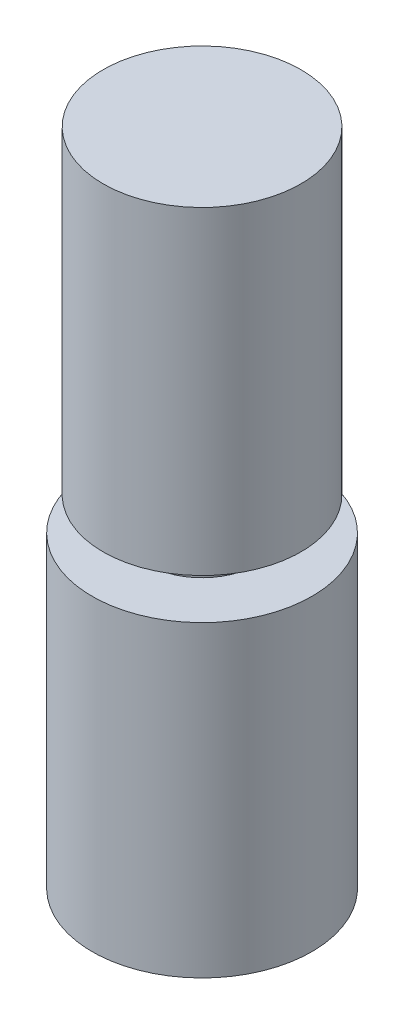
ISO-10303-21;
HEADER;
FILE_DESCRIPTION(('STEP AP214'),'2;1');
FILE_NAME('part.step','',(''),(''),'','','');
FILE_SCHEMA(('AUTOMOTIVE_DESIGN { 1 0 10303 214 1 1 1 1 }'));
ENDSEC;
DATA;
#1=APPLICATION_CONTEXT('core data for automotive mechanical design processes');
#2=APPLICATION_PROTOCOL_DEFINITION('international standard','automotive_design',2000,#1);
#3=PRODUCT_CONTEXT('',#1,'mechanical');
#4=PRODUCT('Part','Part','',(#3));
#5=PRODUCT_RELATED_PRODUCT_CATEGORY('part','',(#4));
#6=PRODUCT_DEFINITION_FORMATION('','',#4);
#7=PRODUCT_DEFINITION_CONTEXT('part definition',#1,'design');
#8=PRODUCT_DEFINITION('design','',#6,#7);
#9=PRODUCT_DEFINITION_SHAPE('','',#8);
#10=(LENGTH_UNIT() NAMED_UNIT(*) SI_UNIT(.MILLI.,.METRE.));
#11=(NAMED_UNIT(*) PLANE_ANGLE_UNIT() SI_UNIT($,.RADIAN.));
#12=(NAMED_UNIT(*) SI_UNIT($,.STERADIAN.) SOLID_ANGLE_UNIT());
#13=UNCERTAINTY_MEASURE_WITH_UNIT(LENGTH_MEASURE(1.E-05),#10,'distance_accuracy_value','');
#14=(GEOMETRIC_REPRESENTATION_CONTEXT(3) GLOBAL_UNCERTAINTY_ASSIGNED_CONTEXT((#13)) GLOBAL_UNIT_ASSIGNED_CONTEXT((#10,
#11,#12)) REPRESENTATION_CONTEXT('',''));
#15=CARTESIAN_POINT('',(0.,0.,0.));
#16=DIRECTION('',(0.,0.,1.));
#17=DIRECTION('',(1.,0.,0.));
#18=AXIS2_PLACEMENT_3D('',#15,#16,#17);
#19=CARTESIAN_POINT('',(-20.,0.,0.));
#20=DIRECTION('',(0.,1.,0.));
#21=DIRECTION('',(0.,0.,1.));
#22=AXIS2_PLACEMENT_3D('',#19,#20,#21);
#23=PLANE('',#22);
#24=CARTESIAN_POINT('',(0.,0.,0.));
#25=DIRECTION('',(0.,-1.,0.));
#26=DIRECTION('',(0.,0.,-1.));
#27=AXIS2_PLACEMENT_3D('',#24,#25,#26);
#28=CIRCLE('',#27,20.);
#29=CARTESIAN_POINT('',(0.,0.,-20.));
#30=VERTEX_POINT('',#29);
#31=EDGE_CURVE('E61',#30,#30,#28,.T.);
#32=ORIENTED_EDGE('',*,*,#31,.T.);
#33=EDGE_LOOP('',(#32));
#34=FACE_BOUND('',#33,.T.);
#35=ADVANCED_FACE('F39',(#34),#23,.F.);
#36=CARTESIAN_POINT('',(0.,120.,0.));
#37=DIRECTION('',(0.,-1.,0.));
#38=DIRECTION('',(0.,0.,-1.));
#39=AXIS2_PLACEMENT_3D('',#36,#37,#38);
#40=PLANE('',#39);
#41=CARTESIAN_POINT('',(0.,120.,0.));
#42=DIRECTION('',(0.,-1.,0.));
#43=DIRECTION('',(0.,0.,-1.));
#44=AXIS2_PLACEMENT_3D('',#41,#42,#43);
#45=CIRCLE('',#44,18.);
#46=CARTESIAN_POINT('',(0.,120.,-18.));
#47=VERTEX_POINT('',#46);
#48=EDGE_CURVE('E10',#47,#47,#45,.T.);
#49=ORIENTED_EDGE('',*,*,#48,.F.);
#50=EDGE_LOOP('',(#49));
#51=FACE_BOUND('',#50,.T.);
#52=ADVANCED_FACE('F91',(#51),#40,.F.);
#53=CARTESIAN_POINT('',(0.,0.,0.));
#54=DIRECTION('',(0.,-1.,0.));
#55=DIRECTION('',(0.,0.,-1.));
#56=AXIS2_PLACEMENT_3D('',#53,#54,#55);
#57=CYLINDRICAL_SURFACE('',#56,18.);
#58=CARTESIAN_POINT('',(0.,62.,0.));
#59=DIRECTION('',(0.,-1.,0.));
#60=DIRECTION('',(0.,0.,-1.));
#61=AXIS2_PLACEMENT_3D('',#58,#59,#60);
#62=CIRCLE('',#61,18.);
#63=CARTESIAN_POINT('',(0.,62.,-18.));
#64=VERTEX_POINT('',#63);
#65=EDGE_CURVE('E45',#64,#64,#62,.T.);
#66=ORIENTED_EDGE('',*,*,#65,.F.);
#67=EDGE_LOOP('',(#66));
#68=FACE_BOUND('',#67,.T.);
#69=ORIENTED_EDGE('',*,*,#48,.T.);
#70=EDGE_LOOP('',(#69));
#71=FACE_BOUND('',#70,.T.);
#72=ADVANCED_FACE('F86',(#68,#71),#57,.T.);
#73=CARTESIAN_POINT('',(-18.,62.,0.));
#74=DIRECTION('',(0.,1.,0.));
#75=DIRECTION('',(0.,0.,1.));
#76=AXIS2_PLACEMENT_3D('',#73,#74,#75);
#77=PLANE('',#76);
#78=CARTESIAN_POINT('',(0.,62.,0.));
#79=DIRECTION('',(0.,-1.,0.));
#80=DIRECTION('',(0.,0.,-1.));
#81=AXIS2_PLACEMENT_3D('',#78,#79,#80);
#82=CIRCLE('',#81,10.);
#83=CARTESIAN_POINT('',(0.,62.,-10.));
#84=VERTEX_POINT('',#83);
#85=EDGE_CURVE('E49',#84,#84,#82,.T.);
#86=ORIENTED_EDGE('',*,*,#85,.F.);
#87=EDGE_LOOP('',(#86));
#88=FACE_BOUND('',#87,.T.);
#89=ORIENTED_EDGE('',*,*,#65,.T.);
#90=EDGE_LOOP('',(#89));
#91=FACE_BOUND('',#90,.T.);
#92=ADVANCED_FACE('F81',(#88,#91),#77,.F.);
#93=CARTESIAN_POINT('',(0.,0.,0.));
#94=DIRECTION('',(0.,-1.,0.));
#95=DIRECTION('',(0.,0.,-1.));
#96=AXIS2_PLACEMENT_3D('',#93,#94,#95);
#97=CYLINDRICAL_SURFACE('',#96,10.);
#98=CARTESIAN_POINT('',(0.,56.,0.));
#99=DIRECTION('',(0.,-1.,0.));
#100=DIRECTION('',(0.,0.,-1.));
#101=AXIS2_PLACEMENT_3D('',#98,#99,#100);
#102=CIRCLE('',#101,10.);
#103=CARTESIAN_POINT('',(0.,56.,-10.));
#104=VERTEX_POINT('',#103);
#105=EDGE_CURVE('E53',#104,#104,#102,.T.);
#106=ORIENTED_EDGE('',*,*,#105,.F.);
#107=EDGE_LOOP('',(#106));
#108=FACE_BOUND('',#107,.T.);
#109=ORIENTED_EDGE('',*,*,#85,.T.);
#110=EDGE_LOOP('',(#109));
#111=FACE_BOUND('',#110,.T.);
#112=ADVANCED_FACE('F75',(#108,#111),#97,.T.);
#113=CARTESIAN_POINT('',(-10.,56.,0.));
#114=DIRECTION('',(0.,-1.,0.));
#115=DIRECTION('',(0.,0.,-1.));
#116=AXIS2_PLACEMENT_3D('',#113,#114,#115);
#117=PLANE('',#116);
#118=CARTESIAN_POINT('',(0.,56.,0.));
#119=DIRECTION('',(0.,-1.,0.));
#120=DIRECTION('',(0.,0.,-1.));
#121=AXIS2_PLACEMENT_3D('',#118,#119,#120);
#122=CIRCLE('',#121,20.);
#123=CARTESIAN_POINT('',(0.,56.,-20.));
#124=VERTEX_POINT('',#123);
#125=EDGE_CURVE('E58',#124,#124,#122,.T.);
#126=ORIENTED_EDGE('',*,*,#125,.F.);
#127=EDGE_LOOP('',(#126));
#128=FACE_BOUND('',#127,.T.);
#129=ORIENTED_EDGE('',*,*,#105,.T.);
#130=EDGE_LOOP('',(#129));
#131=FACE_BOUND('',#130,.T.);
#132=ADVANCED_FACE('F69',(#128,#131),#117,.F.);
#133=CARTESIAN_POINT('',(0.,0.,0.));
#134=DIRECTION('',(0.,-1.,0.));
#135=DIRECTION('',(0.,0.,-1.));
#136=AXIS2_PLACEMENT_3D('',#133,#134,#135);
#137=CYLINDRICAL_SURFACE('',#136,20.);
#138=ORIENTED_EDGE('',*,*,#31,.F.);
#139=EDGE_LOOP('',(#138));
#140=FACE_BOUND('',#139,.T.);
#141=ORIENTED_EDGE('',*,*,#125,.T.);
#142=EDGE_LOOP('',(#141));
#143=FACE_BOUND('',#142,.T.);
#144=ADVANCED_FACE('F66',(#140,#143),#137,.T.);
#145=CLOSED_SHELL('',(#35,#52,#72,#92,#112,#132,#144));
#146=MANIFOLD_SOLID_BREP('B2',#145);
#147=ADVANCED_BREP_SHAPE_REPRESENTATION('',(#18,#146),#14);
#148=SHAPE_DEFINITION_REPRESENTATION(#9,#147);
ENDSEC;
END-ISO-10303-21;
